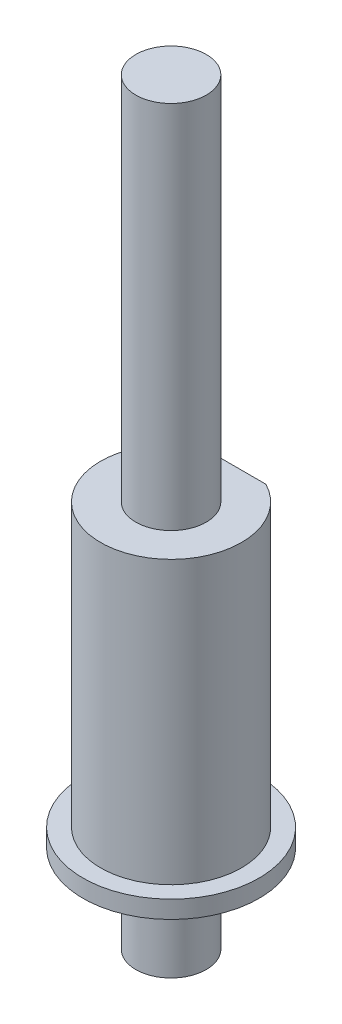
ISO-10303-21;
HEADER;
FILE_DESCRIPTION(('STEP AP214'),'2;1');
FILE_NAME('part.step','',(''),(''),'','','');
FILE_SCHEMA(('AUTOMOTIVE_DESIGN { 1 0 10303 214 1 1 1 1 }'));
ENDSEC;
DATA;
#1=APPLICATION_CONTEXT('core data for automotive mechanical design processes');
#2=APPLICATION_PROTOCOL_DEFINITION('international standard','automotive_design',2000,#1);
#3=PRODUCT_CONTEXT('',#1,'mechanical');
#4=PRODUCT('Part','Part','',(#3));
#5=PRODUCT_RELATED_PRODUCT_CATEGORY('part','',(#4));
#6=PRODUCT_DEFINITION_FORMATION('','',#4);
#7=PRODUCT_DEFINITION_CONTEXT('part definition',#1,'design');
#8=PRODUCT_DEFINITION('design','',#6,#7);
#9=PRODUCT_DEFINITION_SHAPE('','',#8);
#10=(LENGTH_UNIT() NAMED_UNIT(*) SI_UNIT(.MILLI.,.METRE.));
#11=(NAMED_UNIT(*) PLANE_ANGLE_UNIT() SI_UNIT($,.RADIAN.));
#12=(NAMED_UNIT(*) SI_UNIT($,.STERADIAN.) SOLID_ANGLE_UNIT());
#13=UNCERTAINTY_MEASURE_WITH_UNIT(LENGTH_MEASURE(1.E-05),#10,'distance_accuracy_value','');
#14=(GEOMETRIC_REPRESENTATION_CONTEXT(3) GLOBAL_UNCERTAINTY_ASSIGNED_CONTEXT((#13)) GLOBAL_UNIT_ASSIGNED_CONTEXT((#10,
#11,#12)) REPRESENTATION_CONTEXT('',''));
#15=CARTESIAN_POINT('',(0.,0.,0.));
#16=DIRECTION('',(0.,0.,1.));
#17=DIRECTION('',(1.,0.,0.));
#18=AXIS2_PLACEMENT_3D('',#15,#16,#17);
#19=CARTESIAN_POINT('',(0.,3.,0.));
#20=DIRECTION('',(0.,-1.,0.));
#21=DIRECTION('',(0.,0.,-1.));
#22=AXIS2_PLACEMENT_3D('',#19,#20,#21);
#23=PLANE('',#22);
#24=CARTESIAN_POINT('',(0.,3.,0.));
#25=DIRECTION('',(0.,-1.,0.));
#26=DIRECTION('',(0.,0.,-1.));
#27=AXIS2_PLACEMENT_3D('',#24,#25,#26);
#28=CIRCLE('',#27,2.5);
#29=CARTESIAN_POINT('',(0.,3.,-2.5));
#30=VERTEX_POINT('',#29);
#31=EDGE_CURVE('E86',#30,#30,#28,.T.);
#32=ORIENTED_EDGE('',*,*,#31,.F.);
#33=EDGE_LOOP('',(#32));
#34=FACE_BOUND('',#33,.T.);
#35=CARTESIAN_POINT('',(0.,3.,0.));
#36=DIRECTION('',(0.,1.,0.));
#37=DIRECTION('',(0.,0.,1.));
#38=AXIS2_PLACEMENT_3D('',#35,#36,#37);
#39=CIRCLE('',#38,2.);
#40=CARTESIAN_POINT('',(-0.91192104921424,3.,-1.78));
#41=VERTEX_POINT('',#40);
#42=CARTESIAN_POINT('',(0.91192104921424,3.,-1.78));
#43=VERTEX_POINT('',#42);
#44=EDGE_CURVE('E64',#41,#43,#39,.T.);
#45=ORIENTED_EDGE('',*,*,#44,.F.);
#46=DIRECTION('',(-1.,0.,0.));
#47=VECTOR('',#46,1.);
#48=CARTESIAN_POINT('',(0.91192104921424,3.,-1.78));
#49=LINE('',#48,#47);
#50=EDGE_CURVE('E51',#43,#41,#49,.T.);
#51=ORIENTED_EDGE('',*,*,#50,.F.);
#52=EDGE_LOOP('',(#45,#51));
#53=FACE_BOUND('',#52,.T.);
#54=ADVANCED_FACE('F37',(#34,#53),#23,.F.);
#55=CARTESIAN_POINT('',(0.,3.,0.));
#56=DIRECTION('',(0.,-1.,0.));
#57=DIRECTION('',(0.,0.,-1.));
#58=AXIS2_PLACEMENT_3D('',#55,#56,#57);
#59=CYLINDRICAL_SURFACE('',#58,2.5);
#60=ORIENTED_EDGE('',*,*,#31,.T.);
#61=EDGE_LOOP('',(#60));
#62=FACE_BOUND('',#61,.T.);
#63=CARTESIAN_POINT('',(0.,2.5,0.));
#64=DIRECTION('',(0.,-1.,0.));
#65=DIRECTION('',(0.,0.,-1.));
#66=AXIS2_PLACEMENT_3D('',#63,#64,#65);
#67=CIRCLE('',#66,2.5);
#68=CARTESIAN_POINT('',(0.,2.5,-2.5));
#69=VERTEX_POINT('',#68);
#70=EDGE_CURVE('E85',#69,#69,#67,.T.);
#71=ORIENTED_EDGE('',*,*,#70,.F.);
#72=EDGE_LOOP('',(#71));
#73=FACE_BOUND('',#72,.T.);
#74=ADVANCED_FACE('F94',(#62,#73),#59,.T.);
#75=CARTESIAN_POINT('',(0.,2.5,0.));
#76=DIRECTION('',(0.,-1.,0.));
#77=DIRECTION('',(0.,0.,-1.));
#78=AXIS2_PLACEMENT_3D('',#75,#76,#77);
#79=PLANE('',#78);
#80=CARTESIAN_POINT('',(0.,2.5,0.));
#81=DIRECTION('',(0.,-1.,0.));
#82=DIRECTION('',(0.,0.,-1.));
#83=AXIS2_PLACEMENT_3D('',#80,#81,#82);
#84=CIRCLE('',#83,1.);
#85=CARTESIAN_POINT('',(0.,2.5,-1.));
#86=VERTEX_POINT('',#85);
#87=EDGE_CURVE('E79',#86,#86,#84,.T.);
#88=ORIENTED_EDGE('',*,*,#87,.F.);
#89=EDGE_LOOP('',(#88));
#90=FACE_BOUND('',#89,.T.);
#91=ORIENTED_EDGE('',*,*,#70,.T.);
#92=EDGE_LOOP('',(#91));
#93=FACE_BOUND('',#92,.T.);
#94=ADVANCED_FACE('F92',(#90,#93),#79,.T.);
#95=CARTESIAN_POINT('',(0.,0.,0.));
#96=DIRECTION('',(0.,1.,0.));
#97=DIRECTION('',(0.,0.,1.));
#98=AXIS2_PLACEMENT_3D('',#95,#96,#97);
#99=PLANE('',#98);
#100=CARTESIAN_POINT('',(0.,0.,0.));
#101=DIRECTION('',(0.,1.,0.));
#102=DIRECTION('',(0.,0.,1.));
#103=AXIS2_PLACEMENT_3D('',#100,#101,#102);
#104=CIRCLE('',#103,1.);
#105=CARTESIAN_POINT('',(0.,0.,1.));
#106=VERTEX_POINT('',#105);
#107=EDGE_CURVE('E41',#106,#106,#104,.T.);
#108=ORIENTED_EDGE('',*,*,#107,.F.);
#109=EDGE_LOOP('',(#108));
#110=FACE_BOUND('',#109,.T.);
#111=ADVANCED_FACE('F102',(#110),#99,.F.);
#112=CARTESIAN_POINT('',(0.,21.5,0.));
#113=DIRECTION('',(0.,-1.,0.));
#114=DIRECTION('',(0.,0.,-1.));
#115=AXIS2_PLACEMENT_3D('',#112,#113,#114);
#116=CYLINDRICAL_SURFACE('',#115,1.);
#117=ORIENTED_EDGE('',*,*,#87,.T.);
#118=EDGE_LOOP('',(#117));
#119=FACE_BOUND('',#118,.T.);
#120=ORIENTED_EDGE('',*,*,#107,.T.);
#121=EDGE_LOOP('',(#120));
#122=FACE_BOUND('',#121,.T.);
#123=ADVANCED_FACE('F39',(#119,#122),#116,.T.);
#124=CARTESIAN_POINT('',(0.,11.,0.));
#125=DIRECTION('',(0.,1.,0.));
#126=DIRECTION('',(0.,0.,1.));
#127=AXIS2_PLACEMENT_3D('',#124,#125,#126);
#128=PLANE('',#127);
#129=CARTESIAN_POINT('',(0.,11.,0.));
#130=DIRECTION('',(0.,1.,0.));
#131=DIRECTION('',(0.,0.,1.));
#132=AXIS2_PLACEMENT_3D('',#129,#130,#131);
#133=CIRCLE('',#132,2.);
#134=CARTESIAN_POINT('',(-0.91192104921424,11.,-1.78));
#135=VERTEX_POINT('',#134);
#136=CARTESIAN_POINT('',(0.91192104921424,11.,-1.78));
#137=VERTEX_POINT('',#136);
#138=EDGE_CURVE('E75',#135,#137,#133,.T.);
#139=ORIENTED_EDGE('',*,*,#138,.T.);
#140=DIRECTION('',(-1.,0.,0.));
#141=VECTOR('',#140,1.);
#142=CARTESIAN_POINT('',(0.91192104921424,11.,-1.78));
#143=LINE('',#142,#141);
#144=EDGE_CURVE('E59',#137,#135,#143,.T.);
#145=ORIENTED_EDGE('',*,*,#144,.T.);
#146=EDGE_LOOP('',(#139,#145));
#147=FACE_BOUND('',#146,.T.);
#148=CARTESIAN_POINT('',(0.,11.,0.));
#149=DIRECTION('',(0.,1.,0.));
#150=DIRECTION('',(0.,0.,1.));
#151=AXIS2_PLACEMENT_3D('',#148,#149,#150);
#152=CIRCLE('',#151,1.);
#153=CARTESIAN_POINT('',(0.,11.,1.));
#154=VERTEX_POINT('',#153);
#155=EDGE_CURVE('E68',#154,#154,#152,.T.);
#156=ORIENTED_EDGE('',*,*,#155,.F.);
#157=EDGE_LOOP('',(#156));
#158=FACE_BOUND('',#157,.T.);
#159=ADVANCED_FACE('F117',(#147,#158),#128,.T.);
#160=CARTESIAN_POINT('',(0.,11.,0.));
#161=DIRECTION('',(0.,-1.,0.));
#162=DIRECTION('',(0.,0.,-1.));
#163=AXIS2_PLACEMENT_3D('',#160,#161,#162);
#164=CYLINDRICAL_SURFACE('',#163,2.);
#165=ORIENTED_EDGE('',*,*,#44,.T.);
#166=DIRECTION('',(0.,-1.,0.));
#167=VECTOR('',#166,1.);
#168=CARTESIAN_POINT('',(0.91192104921424,11.,-1.78));
#169=LINE('',#168,#167);
#170=EDGE_CURVE('E74',#137,#43,#169,.T.);
#171=ORIENTED_EDGE('',*,*,#170,.F.);
#172=ORIENTED_EDGE('',*,*,#138,.F.);
#173=DIRECTION('',(0.,-1.,0.));
#174=VECTOR('',#173,1.);
#175=CARTESIAN_POINT('',(-0.91192104921424,11.,-1.78));
#176=LINE('',#175,#174);
#177=EDGE_CURVE('E72',#135,#41,#176,.T.);
#178=ORIENTED_EDGE('',*,*,#177,.T.);
#179=EDGE_LOOP('',(#165,#171,#172,#178));
#180=FACE_BOUND('',#179,.T.);
#181=ADVANCED_FACE('F77',(#180),#164,.T.);
#182=CARTESIAN_POINT('',(0.91192104921424,11.,-1.78));
#183=DIRECTION('',(0.,0.,1.));
#184=DIRECTION('',(1.,0.,0.));
#185=AXIS2_PLACEMENT_3D('',#182,#183,#184);
#186=PLANE('',#185);
#187=ORIENTED_EDGE('',*,*,#50,.T.);
#188=ORIENTED_EDGE('',*,*,#177,.F.);
#189=ORIENTED_EDGE('',*,*,#144,.F.);
#190=ORIENTED_EDGE('',*,*,#170,.T.);
#191=EDGE_LOOP('',(#187,#188,#189,#190));
#192=FACE_BOUND('',#191,.T.);
#193=ADVANCED_FACE('F71',(#192),#186,.F.);
#194=CARTESIAN_POINT('',(0.,21.5,0.));
#195=DIRECTION('',(0.,1.,0.));
#196=DIRECTION('',(0.,0.,1.));
#197=AXIS2_PLACEMENT_3D('',#194,#195,#196);
#198=PLANE('',#197);
#199=CARTESIAN_POINT('',(0.,21.5,0.));
#200=DIRECTION('',(0.,1.,0.));
#201=DIRECTION('',(0.,0.,1.));
#202=AXIS2_PLACEMENT_3D('',#199,#200,#201);
#203=CIRCLE('',#202,1.);
#204=CARTESIAN_POINT('',(0.,21.5,1.));
#205=VERTEX_POINT('',#204);
#206=EDGE_CURVE('E11',#205,#205,#203,.T.);
#207=ORIENTED_EDGE('',*,*,#206,.T.);
#208=EDGE_LOOP('',(#207));
#209=FACE_BOUND('',#208,.T.);
#210=ADVANCED_FACE('F108',(#209),#198,.T.);
#211=ORIENTED_EDGE('',*,*,#155,.T.);
#212=EDGE_LOOP('',(#211));
#213=FACE_BOUND('',#212,.T.);
#214=ORIENTED_EDGE('',*,*,#206,.F.);
#215=EDGE_LOOP('',(#214));
#216=FACE_BOUND('',#215,.T.);
#217=ADVANCED_FACE('F110',(#213,#216),#116,.T.);
#218=CLOSED_SHELL('',(#54,#74,#94,#111,#123,#159,#181,#193,#210,#217));
#219=MANIFOLD_SOLID_BREP('B2',#218);
#220=ADVANCED_BREP_SHAPE_REPRESENTATION('',(#18,#219),#14);
#221=SHAPE_DEFINITION_REPRESENTATION(#9,#220);
ENDSEC;
END-ISO-10303-21;
